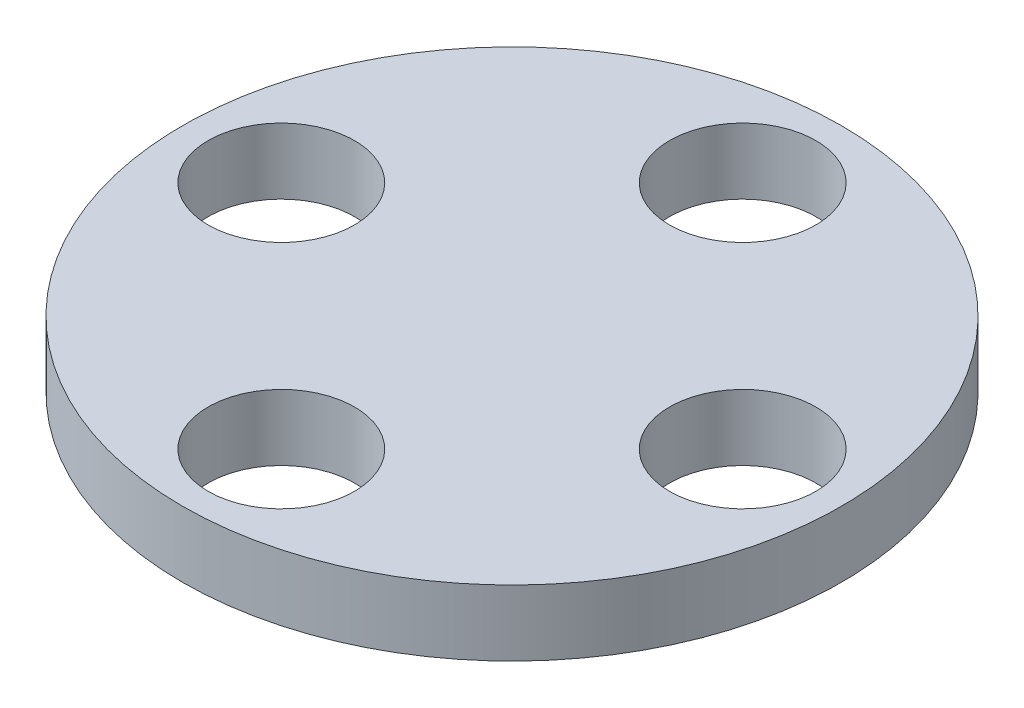
ISO-10303-21;
HEADER;
FILE_DESCRIPTION(('STEP AP214'),'2;1');
FILE_NAME('part.step','',(''),(''),'','','');
FILE_SCHEMA(('AUTOMOTIVE_DESIGN { 1 0 10303 214 1 1 1 1 }'));
ENDSEC;
DATA;
#1=APPLICATION_CONTEXT('core data for automotive mechanical design processes');
#2=APPLICATION_PROTOCOL_DEFINITION('international standard','automotive_design',2000,#1);
#3=PRODUCT_CONTEXT('',#1,'mechanical');
#4=PRODUCT('Part','Part','',(#3));
#5=PRODUCT_RELATED_PRODUCT_CATEGORY('part','',(#4));
#6=PRODUCT_DEFINITION_FORMATION('','',#4);
#7=PRODUCT_DEFINITION_CONTEXT('part definition',#1,'design');
#8=PRODUCT_DEFINITION('design','',#6,#7);
#9=PRODUCT_DEFINITION_SHAPE('','',#8);
#10=(LENGTH_UNIT() NAMED_UNIT(*) SI_UNIT(.MILLI.,.METRE.));
#11=(NAMED_UNIT(*) PLANE_ANGLE_UNIT() SI_UNIT($,.RADIAN.));
#12=(NAMED_UNIT(*) SI_UNIT($,.STERADIAN.) SOLID_ANGLE_UNIT());
#13=UNCERTAINTY_MEASURE_WITH_UNIT(LENGTH_MEASURE(1.E-05),#10,'distance_accuracy_value','');
#14=(GEOMETRIC_REPRESENTATION_CONTEXT(3) GLOBAL_UNCERTAINTY_ASSIGNED_CONTEXT((#13)) GLOBAL_UNIT_ASSIGNED_CONTEXT((#10,
#11,#12)) REPRESENTATION_CONTEXT('',''));
#15=CARTESIAN_POINT('',(0.,0.,0.));
#16=DIRECTION('',(0.,0.,1.));
#17=DIRECTION('',(1.,0.,0.));
#18=AXIS2_PLACEMENT_3D('',#15,#16,#17);
#19=CARTESIAN_POINT('',(1.24701431911483E-13,2.54,0.76910058994196));
#20=DIRECTION('',(0.,1.,0.));
#21=DIRECTION('',(0.,0.,1.));
#22=AXIS2_PLACEMENT_3D('',#19,#20,#21);
#23=PLANE('',#22);
#24=CARTESIAN_POINT('',(1.87324325618335E-13,2.54,9.65910058994196));
#25=DIRECTION('',(0.,1.,0.));
#26=DIRECTION('',(0.,0.,1.));
#27=AXIS2_PLACEMENT_3D('',#24,#25,#26);
#28=CIRCLE('',#27,2.8194);
#29=CARTESIAN_POINT('',(1.87324325618335E-13,2.54,12.478500589942));
#30=VERTEX_POINT('',#29);
#31=EDGE_CURVE('E64',#30,#30,#28,.T.);
#32=ORIENTED_EDGE('',*,*,#31,.F.);
#33=EDGE_LOOP('',(#32));
#34=FACE_BOUND('',#33,.T.);
#35=CARTESIAN_POINT('',(0.,2.54,-8.12089941005804));
#36=DIRECTION('',(0.,1.,0.));
#37=DIRECTION('',(0.,0.,1.));
#38=AXIS2_PLACEMENT_3D('',#35,#36,#37);
#39=CIRCLE('',#38,2.8194);
#40=CARTESIAN_POINT('',(0.,2.54,-5.30149941005804));
#41=VERTEX_POINT('',#40);
#42=EDGE_CURVE('E50',#41,#41,#39,.T.);
#43=ORIENTED_EDGE('',*,*,#42,.F.);
#44=EDGE_LOOP('',(#43));
#45=FACE_BOUND('',#44,.T.);
#46=CARTESIAN_POINT('',(1.24701431911483E-13,2.54,0.76910058994196));
#47=DIRECTION('',(0.,1.,0.));
#48=DIRECTION('',(0.,0.,1.));
#49=AXIS2_PLACEMENT_3D('',#46,#47,#48);
#50=CIRCLE('',#49,12.7);
#51=CARTESIAN_POINT('',(1.24701431911483E-13,2.54,13.469100589942));
#52=VERTEX_POINT('',#51);
#53=EDGE_CURVE('E10',#52,#52,#50,.T.);
#54=ORIENTED_EDGE('',*,*,#53,.T.);
#55=EDGE_LOOP('',(#54));
#56=FACE_BOUND('',#55,.T.);
#57=CARTESIAN_POINT('',(8.89000000000012,2.54,0.769100589941867));
#58=DIRECTION('',(0.,1.,0.));
#59=DIRECTION('',(0.,0.,1.));
#60=AXIS2_PLACEMENT_3D('',#57,#58,#59);
#61=CIRCLE('',#60,2.8194);
#62=CARTESIAN_POINT('',(8.89000000000012,2.54,3.58850058994187));
#63=VERTEX_POINT('',#62);
#64=EDGE_CURVE('E56',#63,#63,#61,.T.);
#65=ORIENTED_EDGE('',*,*,#64,.F.);
#66=EDGE_LOOP('',(#65));
#67=FACE_BOUND('',#66,.T.);
#68=CARTESIAN_POINT('',(-8.88999999999988,2.54,0.769100589941991));
#69=DIRECTION('',(0.,1.,0.));
#70=DIRECTION('',(0.,0.,1.));
#71=AXIS2_PLACEMENT_3D('',#68,#69,#70);
#72=CIRCLE('',#71,2.8194);
#73=CARTESIAN_POINT('',(-8.88999999999988,2.54,3.58850058994199));
#74=VERTEX_POINT('',#73);
#75=EDGE_CURVE('E72',#74,#74,#72,.T.);
#76=ORIENTED_EDGE('',*,*,#75,.F.);
#77=EDGE_LOOP('',(#76));
#78=FACE_BOUND('',#77,.T.);
#79=ADVANCED_FACE('F37',(#34,#45,#56,#67,#78),#23,.T.);
#80=CARTESIAN_POINT('',(1.24701431911483E-13,0.,0.76910058994196));
#81=DIRECTION('',(0.,1.,0.));
#82=DIRECTION('',(0.,0.,1.));
#83=AXIS2_PLACEMENT_3D('',#80,#81,#82);
#84=PLANE('',#83);
#85=CARTESIAN_POINT('',(1.24701431911483E-13,0.,0.76910058994196));
#86=DIRECTION('',(0.,1.,0.));
#87=DIRECTION('',(0.,0.,1.));
#88=AXIS2_PLACEMENT_3D('',#85,#86,#87);
#89=CIRCLE('',#88,12.7);
#90=CARTESIAN_POINT('',(1.24701431911483E-13,0.,13.469100589942));
#91=VERTEX_POINT('',#90);
#92=EDGE_CURVE('E41',#91,#91,#89,.T.);
#93=ORIENTED_EDGE('',*,*,#92,.F.);
#94=EDGE_LOOP('',(#93));
#95=FACE_BOUND('',#94,.T.);
#96=CARTESIAN_POINT('',(0.,0.,-8.12089941005804));
#97=DIRECTION('',(0.,1.,0.));
#98=DIRECTION('',(0.,0.,1.));
#99=AXIS2_PLACEMENT_3D('',#96,#97,#98);
#100=CIRCLE('',#99,2.8194);
#101=CARTESIAN_POINT('',(0.,0.,-5.30149941005804));
#102=VERTEX_POINT('',#101);
#103=EDGE_CURVE('E52',#102,#102,#100,.T.);
#104=ORIENTED_EDGE('',*,*,#103,.T.);
#105=EDGE_LOOP('',(#104));
#106=FACE_BOUND('',#105,.T.);
#107=CARTESIAN_POINT('',(8.89000000000012,0.,0.769100589941867));
#108=DIRECTION('',(0.,1.,0.));
#109=DIRECTION('',(0.,0.,1.));
#110=AXIS2_PLACEMENT_3D('',#107,#108,#109);
#111=CIRCLE('',#110,2.8194);
#112=CARTESIAN_POINT('',(8.89000000000012,0.,3.58850058994187));
#113=VERTEX_POINT('',#112);
#114=EDGE_CURVE('E60',#113,#113,#111,.T.);
#115=ORIENTED_EDGE('',*,*,#114,.T.);
#116=EDGE_LOOP('',(#115));
#117=FACE_BOUND('',#116,.T.);
#118=CARTESIAN_POINT('',(1.87324325618335E-13,0.,9.65910058994196));
#119=DIRECTION('',(0.,1.,0.));
#120=DIRECTION('',(0.,0.,1.));
#121=AXIS2_PLACEMENT_3D('',#118,#119,#120);
#122=CIRCLE('',#121,2.8194);
#123=CARTESIAN_POINT('',(1.87324325618335E-13,0.,12.478500589942));
#124=VERTEX_POINT('',#123);
#125=EDGE_CURVE('E68',#124,#124,#122,.T.);
#126=ORIENTED_EDGE('',*,*,#125,.T.);
#127=EDGE_LOOP('',(#126));
#128=FACE_BOUND('',#127,.T.);
#129=CARTESIAN_POINT('',(-8.88999999999988,0.,0.769100589941991));
#130=DIRECTION('',(0.,1.,0.));
#131=DIRECTION('',(0.,0.,1.));
#132=AXIS2_PLACEMENT_3D('',#129,#130,#131);
#133=CIRCLE('',#132,2.8194);
#134=CARTESIAN_POINT('',(-8.88999999999988,0.,3.58850058994199));
#135=VERTEX_POINT('',#134);
#136=EDGE_CURVE('E76',#135,#135,#133,.T.);
#137=ORIENTED_EDGE('',*,*,#136,.T.);
#138=EDGE_LOOP('',(#137));
#139=FACE_BOUND('',#138,.T.);
#140=ADVANCED_FACE('F88',(#95,#106,#117,#128,#139),#84,.F.);
#141=CARTESIAN_POINT('',(1.24701431911483E-13,2.54,0.76910058994196));
#142=DIRECTION('',(0.,-1.,0.));
#143=DIRECTION('',(0.,0.,-1.));
#144=AXIS2_PLACEMENT_3D('',#141,#142,#143);
#145=CYLINDRICAL_SURFACE('',#144,12.7);
#146=ORIENTED_EDGE('',*,*,#53,.F.);
#147=EDGE_LOOP('',(#146));
#148=FACE_BOUND('',#147,.T.);
#149=ORIENTED_EDGE('',*,*,#92,.T.);
#150=EDGE_LOOP('',(#149));
#151=FACE_BOUND('',#150,.T.);
#152=ADVANCED_FACE('F39',(#148,#151),#145,.T.);
#153=CARTESIAN_POINT('',(0.,2.54,-8.12089941005804));
#154=DIRECTION('',(0.,-1.,0.));
#155=DIRECTION('',(0.,0.,-1.));
#156=AXIS2_PLACEMENT_3D('',#153,#154,#155);
#157=CYLINDRICAL_SURFACE('',#156,2.8194);
#158=ORIENTED_EDGE('',*,*,#42,.T.);
#159=EDGE_LOOP('',(#158));
#160=FACE_BOUND('',#159,.T.);
#161=ORIENTED_EDGE('',*,*,#103,.F.);
#162=EDGE_LOOP('',(#161));
#163=FACE_BOUND('',#162,.T.);
#164=ADVANCED_FACE('F98',(#160,#163),#157,.F.);
#165=CARTESIAN_POINT('',(8.89000000000012,2.54,0.769100589941867));
#166=DIRECTION('',(0.,-1.,0.));
#167=DIRECTION('',(0.,0.,-1.));
#168=AXIS2_PLACEMENT_3D('',#165,#166,#167);
#169=CYLINDRICAL_SURFACE('',#168,2.8194);
#170=ORIENTED_EDGE('',*,*,#64,.T.);
#171=EDGE_LOOP('',(#170));
#172=FACE_BOUND('',#171,.T.);
#173=ORIENTED_EDGE('',*,*,#114,.F.);
#174=EDGE_LOOP('',(#173));
#175=FACE_BOUND('',#174,.T.);
#176=ADVANCED_FACE('F101',(#172,#175),#169,.F.);
#177=CARTESIAN_POINT('',(1.87324325618335E-13,2.54,9.65910058994196));
#178=DIRECTION('',(0.,-1.,0.));
#179=DIRECTION('',(0.,0.,-1.));
#180=AXIS2_PLACEMENT_3D('',#177,#178,#179);
#181=CYLINDRICAL_SURFACE('',#180,2.8194);
#182=ORIENTED_EDGE('',*,*,#31,.T.);
#183=EDGE_LOOP('',(#182));
#184=FACE_BOUND('',#183,.T.);
#185=ORIENTED_EDGE('',*,*,#125,.F.);
#186=EDGE_LOOP('',(#185));
#187=FACE_BOUND('',#186,.T.);
#188=ADVANCED_FACE('F105',(#184,#187),#181,.F.);
#189=CARTESIAN_POINT('',(-8.88999999999988,2.54,0.769100589941991));
#190=DIRECTION('',(0.,-1.,0.));
#191=DIRECTION('',(0.,0.,-1.));
#192=AXIS2_PLACEMENT_3D('',#189,#190,#191);
#193=CYLINDRICAL_SURFACE('',#192,2.8194);
#194=ORIENTED_EDGE('',*,*,#75,.T.);
#195=EDGE_LOOP('',(#194));
#196=FACE_BOUND('',#195,.T.);
#197=ORIENTED_EDGE('',*,*,#136,.F.);
#198=EDGE_LOOP('',(#197));
#199=FACE_BOUND('',#198,.T.);
#200=ADVANCED_FACE('F84',(#196,#199),#193,.F.);
#201=CLOSED_SHELL('',(#79,#140,#152,#164,#176,#188,#200));
#202=MANIFOLD_SOLID_BREP('B2',#201);
#203=ADVANCED_BREP_SHAPE_REPRESENTATION('',(#18,#202),#14);
#204=SHAPE_DEFINITION_REPRESENTATION(#9,#203);
ENDSEC;
END-ISO-10303-21;
